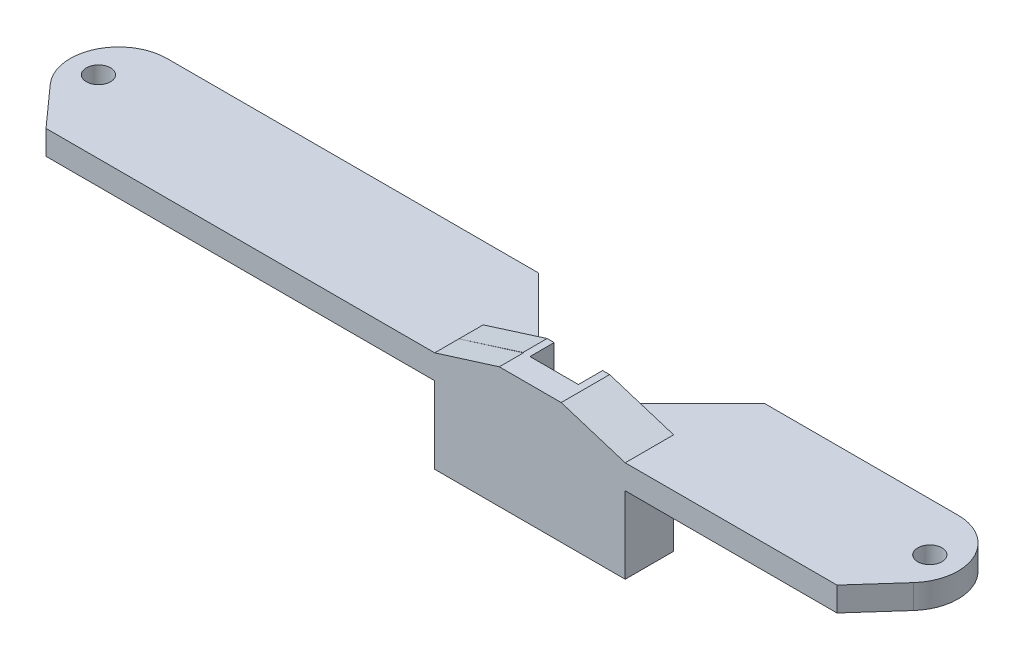
ISO-10303-21;
HEADER;
FILE_DESCRIPTION(('STEP AP214'),'2;1');
FILE_NAME('part.step','',(''),(''),'','','');
FILE_SCHEMA(('AUTOMOTIVE_DESIGN { 1 0 10303 214 1 1 1 1 }'));
ENDSEC;
DATA;
#1=APPLICATION_CONTEXT('core data for automotive mechanical design processes');
#2=APPLICATION_PROTOCOL_DEFINITION('international standard','automotive_design',2000,#1);
#3=PRODUCT_CONTEXT('',#1,'mechanical');
#4=PRODUCT('Part','Part','',(#3));
#5=PRODUCT_RELATED_PRODUCT_CATEGORY('part','',(#4));
#6=PRODUCT_DEFINITION_FORMATION('','',#4);
#7=PRODUCT_DEFINITION_CONTEXT('part definition',#1,'design');
#8=PRODUCT_DEFINITION('design','',#6,#7);
#9=PRODUCT_DEFINITION_SHAPE('','',#8);
#10=(LENGTH_UNIT() NAMED_UNIT(*) SI_UNIT(.MILLI.,.METRE.));
#11=(NAMED_UNIT(*) PLANE_ANGLE_UNIT() SI_UNIT($,.RADIAN.));
#12=(NAMED_UNIT(*) SI_UNIT($,.STERADIAN.) SOLID_ANGLE_UNIT());
#13=UNCERTAINTY_MEASURE_WITH_UNIT(LENGTH_MEASURE(1.E-05),#10,'distance_accuracy_value','');
#14=(GEOMETRIC_REPRESENTATION_CONTEXT(3) GLOBAL_UNCERTAINTY_ASSIGNED_CONTEXT((#13)) GLOBAL_UNIT_ASSIGNED_CONTEXT((#10,
#11,#12)) REPRESENTATION_CONTEXT('',''));
#15=CARTESIAN_POINT('',(0.,0.,0.));
#16=DIRECTION('',(0.,0.,1.));
#17=DIRECTION('',(1.,0.,0.));
#18=AXIS2_PLACEMENT_3D('',#15,#16,#17);
#19=CARTESIAN_POINT('',(-49.,3.,0.));
#20=DIRECTION('',(0.,-1.,0.));
#21=DIRECTION('',(0.,0.,-1.));
#22=AXIS2_PLACEMENT_3D('',#19,#20,#21);
#23=CYLINDRICAL_SURFACE('',#22,6.00000000000001);
#24=DIRECTION('',(0.,1.,0.));
#25=VECTOR('',#24,1.);
#26=CARTESIAN_POINT('',(-53.4721359549996,-6.70820393249936,4.00000000000002));
#27=LINE('',#26,#25);
#28=CARTESIAN_POINT('',(-53.4721359549996,0.,4.00000000000002));
#29=VERTEX_POINT('',#28);
#30=CARTESIAN_POINT('',(-53.4721359549996,3.,4.00000000000002));
#31=VERTEX_POINT('',#30);
#32=EDGE_CURVE('E238',#29,#31,#27,.T.);
#33=ORIENTED_EDGE('',*,*,#32,.T.);
#34=CARTESIAN_POINT('',(-49.,3.,0.));
#35=DIRECTION('',(0.,1.,0.));
#36=DIRECTION('',(0.,0.,1.));
#37=AXIS2_PLACEMENT_3D('',#34,#35,#36);
#38=CIRCLE('',#37,6.00000000000001);
#39=CARTESIAN_POINT('',(-49.,3.,-6.00000000000001));
#40=VERTEX_POINT('',#39);
#41=EDGE_CURVE('E250',#40,#31,#38,.T.);
#42=ORIENTED_EDGE('',*,*,#41,.F.);
#43=DIRECTION('',(0.,-1.,0.));
#44=VECTOR('',#43,1.);
#45=CARTESIAN_POINT('',(-49.,3.,-6.00000000000001));
#46=LINE('',#45,#44);
#47=CARTESIAN_POINT('',(-49.,0.,-6.00000000000001));
#48=VERTEX_POINT('',#47);
#49=EDGE_CURVE('E282',#40,#48,#46,.T.);
#50=ORIENTED_EDGE('',*,*,#49,.T.);
#51=CARTESIAN_POINT('',(-49.,0.,0.));
#52=DIRECTION('',(0.,1.,0.));
#53=DIRECTION('',(0.,0.,1.));
#54=AXIS2_PLACEMENT_3D('',#51,#52,#53);
#55=CIRCLE('',#54,6.00000000000001);
#56=EDGE_CURVE('E253',#48,#29,#55,.T.);
#57=ORIENTED_EDGE('',*,*,#56,.T.);
#58=EDGE_LOOP('',(#33,#42,#50,#57));
#59=FACE_BOUND('',#58,.T.);
#60=ADVANCED_FACE('F75',(#59),#23,.T.);
#61=CARTESIAN_POINT('',(-49.,3.,6.00000000000001));
#62=DIRECTION('',(0.,0.,-1.));
#63=DIRECTION('',(-1.,0.,0.));
#64=AXIS2_PLACEMENT_3D('',#61,#62,#63);
#65=PLANE('',#64);
#66=DIRECTION('',(-0.95447997803503,-0.298274993135947,0.));
#67=VECTOR('',#66,1.);
#68=CARTESIAN_POINT('',(-44.7152961585631,-10.7110522925982,6.00000000000001));
#69=LINE('',#68,#67);
#70=CARTESIAN_POINT('',(7.16007117775133,5.5,6.00000000000001));
#71=VERTEX_POINT('',#70);
#72=CARTESIAN_POINT('',(-0.839928822248676,3.,6.00000000000001));
#73=VERTEX_POINT('',#72);
#74=EDGE_CURVE('E442',#71,#73,#69,.T.);
#75=ORIENTED_EDGE('',*,*,#74,.F.);
#76=DIRECTION('',(1.,0.,0.));
#77=VECTOR('',#76,1.);
#78=CARTESIAN_POINT('',(0.,5.5,6.00000000000001));
#79=LINE('',#78,#77);
#80=CARTESIAN_POINT('',(7.08905818365937,5.5,6.00000000000001));
#81=VERTEX_POINT('',#80);
#82=EDGE_CURVE('E448',#81,#71,#79,.T.);
#83=ORIENTED_EDGE('',*,*,#82,.F.);
#84=DIRECTION('',(-0.953716950748227,-0.300705799504274,0.));
#85=VECTOR('',#84,1.);
#86=CARTESIAN_POINT('',(7.08905818365937,5.5,6.00000000000001));
#87=LINE('',#86,#85);
#88=EDGE_CURVE('E99',#81,#73,#87,.T.);
#89=ORIENTED_EDGE('',*,*,#88,.T.);
#90=EDGE_LOOP('',(#75,#83,#89));
#91=FACE_BOUND('',#90,.T.);
#92=ADVANCED_FACE('F321',(#91),#65,.F.);
#93=CARTESIAN_POINT('',(7.96007117775133,-7.,6.99999999999999));
#94=DIRECTION('',(1.,0.,0.));
#95=DIRECTION('',(0.,0.,-1.));
#96=AXIS2_PLACEMENT_3D('',#93,#94,#95);
#97=PLANE('',#96);
#98=DIRECTION('',(0.,-1.,0.));
#99=VECTOR('',#98,1.);
#100=CARTESIAN_POINT('',(7.96007117775133,3.,6.00000000000001));
#101=LINE('',#100,#99);
#102=CARTESIAN_POINT('',(7.96007117775133,5.5,6.00000000000001));
#103=VERTEX_POINT('',#102);
#104=CARTESIAN_POINT('',(7.96007117775133,-9.,6.00000000000001));
#105=VERTEX_POINT('',#104);
#106=EDGE_CURVE('E274',#103,#105,#101,.T.);
#107=ORIENTED_EDGE('',*,*,#106,.T.);
#108=DIRECTION('',(0.,0.,1.));
#109=VECTOR('',#108,1.);
#110=CARTESIAN_POINT('',(7.96007117775133,-9.,-3.02079728939615));
#111=LINE('',#110,#109);
#112=CARTESIAN_POINT('',(7.96007117775133,-9.,2.99999999999999));
#113=VERTEX_POINT('',#112);
#114=EDGE_CURVE('E405',#113,#105,#111,.T.);
#115=ORIENTED_EDGE('',*,*,#114,.F.);
#116=DIRECTION('',(0.,-1.,0.));
#117=VECTOR('',#116,1.);
#118=CARTESIAN_POINT('',(7.96007117775133,-7.,2.99999999999999));
#119=LINE('',#118,#117);
#120=CARTESIAN_POINT('',(7.96007117775133,5.5,2.99999999999999));
#121=VERTEX_POINT('',#120);
#122=EDGE_CURVE('E278',#121,#113,#119,.T.);
#123=ORIENTED_EDGE('',*,*,#122,.F.);
#124=DIRECTION('',(0.,0.,-1.));
#125=VECTOR('',#124,1.);
#126=CARTESIAN_POINT('',(7.96007117775133,5.5,6.00000000000001));
#127=LINE('',#126,#125);
#128=EDGE_CURVE('E303',#103,#121,#127,.T.);
#129=ORIENTED_EDGE('',*,*,#128,.F.);
#130=EDGE_LOOP('',(#107,#115,#123,#129));
#131=FACE_BOUND('',#130,.T.);
#132=ADVANCED_FACE('F328',(#131),#97,.T.);
#133=CARTESIAN_POINT('',(13.9600711777513,-9.5,6.00000000000001));
#134=DIRECTION('',(1.,0.,0.));
#135=DIRECTION('',(0.,0.,-1.));
#136=AXIS2_PLACEMENT_3D('',#133,#134,#135);
#137=PLANE('',#136);
#138=DIRECTION('',(0.,0.,1.));
#139=VECTOR('',#138,1.);
#140=CARTESIAN_POINT('',(13.9600711777513,-9.,-3.02079728939615));
#141=LINE('',#140,#139);
#142=CARTESIAN_POINT('',(13.9600711777513,-9.,2.99999999999999));
#143=VERTEX_POINT('',#142);
#144=CARTESIAN_POINT('',(13.9600711777513,-9.,6.00000000000001));
#145=VERTEX_POINT('',#144);
#146=EDGE_CURVE('E401',#143,#145,#141,.T.);
#147=ORIENTED_EDGE('',*,*,#146,.T.);
#148=DIRECTION('',(0.,1.,0.));
#149=VECTOR('',#148,1.);
#150=CARTESIAN_POINT('',(13.9600711777513,-9.5,6.00000000000001));
#151=LINE('',#150,#149);
#152=CARTESIAN_POINT('',(13.9600711777513,5.5,6.00000000000001));
#153=VERTEX_POINT('',#152);
#154=EDGE_CURVE('E266',#145,#153,#151,.T.);
#155=ORIENTED_EDGE('',*,*,#154,.T.);
#156=DIRECTION('',(0.,0.,-1.));
#157=VECTOR('',#156,1.);
#158=CARTESIAN_POINT('',(13.9600711777513,5.5,6.00000000000001));
#159=LINE('',#158,#157);
#160=CARTESIAN_POINT('',(13.9600711777513,5.5,2.99999999999999));
#161=VERTEX_POINT('',#160);
#162=EDGE_CURVE('E427',#153,#161,#159,.T.);
#163=ORIENTED_EDGE('',*,*,#162,.T.);
#164=DIRECTION('',(0.,1.,0.));
#165=VECTOR('',#164,1.);
#166=CARTESIAN_POINT('',(13.9600711777513,-9.5,2.99999999999999));
#167=LINE('',#166,#165);
#168=EDGE_CURVE('E261',#143,#161,#167,.T.);
#169=ORIENTED_EDGE('',*,*,#168,.F.);
#170=EDGE_LOOP('',(#147,#155,#163,#169));
#171=FACE_BOUND('',#170,.T.);
#172=ADVANCED_FACE('F333',(#171),#137,.F.);
#173=CARTESIAN_POINT('',(7.96007117775133,-9.5,6.00000000000001));
#174=DIRECTION('',(0.,0.,1.));
#175=DIRECTION('',(1.,0.,0.));
#176=AXIS2_PLACEMENT_3D('',#173,#174,#175);
#177=PLANE('',#176);
#178=DIRECTION('',(1.,0.,0.));
#179=VECTOR('',#178,1.);
#180=CARTESIAN_POINT('',(13.9600711777513,-9.,6.00000000000001));
#181=LINE('',#180,#179);
#182=EDGE_CURVE('E396',#105,#145,#181,.T.);
#183=ORIENTED_EDGE('',*,*,#182,.F.);
#184=ORIENTED_EDGE('',*,*,#106,.F.);
#185=DIRECTION('',(1.,0.,0.));
#186=VECTOR('',#185,1.);
#187=CARTESIAN_POINT('',(7.96007117775133,5.5,6.00000000000001));
#188=LINE('',#187,#186);
#189=EDGE_CURVE('E406',#103,#153,#188,.T.);
#190=ORIENTED_EDGE('',*,*,#189,.T.);
#191=ORIENTED_EDGE('',*,*,#154,.F.);
#192=EDGE_LOOP('',(#183,#184,#190,#191));
#193=FACE_BOUND('',#192,.T.);
#194=ADVANCED_FACE('F362',(#193),#177,.F.);
#195=CARTESIAN_POINT('',(-49.,0.,0.));
#196=DIRECTION('',(0.,1.,0.));
#197=DIRECTION('',(0.,0.,1.));
#198=AXIS2_PLACEMENT_3D('',#195,#196,#197);
#199=PLANE('',#198);
#200=CARTESIAN_POINT('',(49.,0.,0.));
#201=DIRECTION('',(0.,1.,0.));
#202=DIRECTION('',(0.,0.,1.));
#203=AXIS2_PLACEMENT_3D('',#200,#201,#202);
#204=CIRCLE('',#203,6.00000000000001);
#205=CARTESIAN_POINT('',(53.4721359549996,0.,4.00000000000002));
#206=VERTEX_POINT('',#205);
#207=CARTESIAN_POINT('',(49.,0.,-6.00000000000002));
#208=VERTEX_POINT('',#207);
#209=EDGE_CURVE('E494',#206,#208,#204,.T.);
#210=ORIENTED_EDGE('',*,*,#209,.F.);
#211=DIRECTION('',(-0.666666666666667,0.,0.74535599249993));
#212=VECTOR('',#211,1.);
#213=CARTESIAN_POINT('',(49.,0.,9.00000000000001));
#214=LINE('',#213,#212);
#215=CARTESIAN_POINT('',(49.,0.,9.00000000000001));
#216=VERTEX_POINT('',#215);
#217=EDGE_CURVE('E553',#206,#216,#214,.T.);
#218=ORIENTED_EDGE('',*,*,#217,.T.);
#219=DIRECTION('',(1.,0.,0.));
#220=VECTOR('',#219,1.);
#221=CARTESIAN_POINT('',(-49.,0.,9.00000000000001));
#222=LINE('',#221,#220);
#223=CARTESIAN_POINT('',(22.7600711777513,0.,9.00000000000001));
#224=VERTEX_POINT('',#223);
#225=EDGE_CURVE('E528',#224,#216,#222,.T.);
#226=ORIENTED_EDGE('',*,*,#225,.F.);
#227=DIRECTION('',(0.,0.,1.));
#228=VECTOR('',#227,1.);
#229=CARTESIAN_POINT('',(22.7600711777513,0.,0.));
#230=LINE('',#229,#228);
#231=CARTESIAN_POINT('',(22.7600711777513,0.,2.99999999999999));
#232=VERTEX_POINT('',#231);
#233=EDGE_CURVE('E469',#232,#224,#230,.T.);
#234=ORIENTED_EDGE('',*,*,#233,.F.);
#235=DIRECTION('',(1.,0.,0.));
#236=VECTOR('',#235,1.);
#237=CARTESIAN_POINT('',(-49.,0.,2.99999999999999));
#238=LINE('',#237,#236);
#239=CARTESIAN_POINT('',(16.,0.,2.99999999999999));
#240=VERTEX_POINT('',#239);
#241=EDGE_CURVE('E466',#240,#232,#238,.T.);
#242=ORIENTED_EDGE('',*,*,#241,.F.);
#243=DIRECTION('',(0.707106781186549,0.,-0.707106781186546));
#244=VECTOR('',#243,1.);
#245=CARTESIAN_POINT('',(9.49999999999997,0.,9.5));
#246=LINE('',#245,#244);
#247=CARTESIAN_POINT('',(25.,0.,-6.00000000000001));
#248=VERTEX_POINT('',#247);
#249=EDGE_CURVE('E478',#240,#248,#246,.T.);
#250=ORIENTED_EDGE('',*,*,#249,.T.);
#251=DIRECTION('',(1.,0.,0.));
#252=VECTOR('',#251,1.);
#253=CARTESIAN_POINT('',(-49.,0.,-6.00000000000001));
#254=LINE('',#253,#252);
#255=EDGE_CURVE('E500',#248,#208,#254,.T.);
#256=ORIENTED_EDGE('',*,*,#255,.T.);
#257=EDGE_LOOP('',(#210,#218,#226,#234,#242,#250,#256));
#258=FACE_BOUND('',#257,.T.);
#259=CARTESIAN_POINT('',(51.5,0.,0.));
#260=DIRECTION('',(0.,1.,0.));
#261=DIRECTION('',(0.,0.,1.));
#262=AXIS2_PLACEMENT_3D('',#259,#260,#261);
#263=CIRCLE('',#262,1.5);
#264=CARTESIAN_POINT('',(51.5,0.,1.5));
#265=VERTEX_POINT('',#264);
#266=EDGE_CURVE('E490',#265,#265,#263,.T.);
#267=ORIENTED_EDGE('',*,*,#266,.T.);
#268=EDGE_LOOP('',(#267));
#269=FACE_BOUND('',#268,.T.);
#270=ADVANCED_FACE('F357',(#258,#269),#199,.F.);
#271=CARTESIAN_POINT('',(-49.,3.,0.));
#272=DIRECTION('',(0.,1.,0.));
#273=DIRECTION('',(0.,0.,1.));
#274=AXIS2_PLACEMENT_3D('',#271,#272,#273);
#275=PLANE('',#274);
#276=DIRECTION('',(0.666666666666667,0.,-0.74535599249993));
#277=VECTOR('',#276,1.);
#278=CARTESIAN_POINT('',(49.,3.,9.00000000000001));
#279=LINE('',#278,#277);
#280=CARTESIAN_POINT('',(49.,3.,9.00000000000001));
#281=VERTEX_POINT('',#280);
#282=CARTESIAN_POINT('',(53.4721359549996,3.,4.00000000000002));
#283=VERTEX_POINT('',#282);
#284=EDGE_CURVE('E246',#281,#283,#279,.T.);
#285=ORIENTED_EDGE('',*,*,#284,.T.);
#286=CARTESIAN_POINT('',(49.,3.,0.));
#287=DIRECTION('',(0.,1.,0.));
#288=DIRECTION('',(0.,0.,1.));
#289=AXIS2_PLACEMENT_3D('',#286,#287,#288);
#290=CIRCLE('',#289,6.00000000000001);
#291=CARTESIAN_POINT('',(49.,3.,-6.00000000000002));
#292=VERTEX_POINT('',#291);
#293=EDGE_CURVE('E497',#283,#292,#290,.T.);
#294=ORIENTED_EDGE('',*,*,#293,.T.);
#295=DIRECTION('',(1.,0.,0.));
#296=VECTOR('',#295,1.);
#297=CARTESIAN_POINT('',(-49.,3.,-6.00000000000001));
#298=LINE('',#297,#296);
#299=CARTESIAN_POINT('',(25.,3.,-6.00000000000001));
#300=VERTEX_POINT('',#299);
#301=EDGE_CURVE('E499',#300,#292,#298,.T.);
#302=ORIENTED_EDGE('',*,*,#301,.F.);
#303=DIRECTION('',(0.707106781186549,0.,-0.707106781186546));
#304=VECTOR('',#303,1.);
#305=CARTESIAN_POINT('',(9.49999999999997,3.,9.5));
#306=LINE('',#305,#304);
#307=CARTESIAN_POINT('',(16.,3.,2.99999999999999));
#308=VERTEX_POINT('',#307);
#309=EDGE_CURVE('E481',#308,#300,#306,.T.);
#310=ORIENTED_EDGE('',*,*,#309,.F.);
#311=DIRECTION('',(1.,0.,0.));
#312=VECTOR('',#311,1.);
#313=CARTESIAN_POINT('',(-49.,3.,2.99999999999999));
#314=LINE('',#313,#312);
#315=CARTESIAN_POINT('',(22.7600711777513,3.,2.99999999999999));
#316=VERTEX_POINT('',#315);
#317=EDGE_CURVE('E461',#308,#316,#314,.T.);
#318=ORIENTED_EDGE('',*,*,#317,.T.);
#319=DIRECTION('',(0.,0.,1.));
#320=VECTOR('',#319,1.);
#321=CARTESIAN_POINT('',(22.7600711777513,3.,0.));
#322=LINE('',#321,#320);
#323=CARTESIAN_POINT('',(22.7600711777513,3.,9.00000000000001));
#324=VERTEX_POINT('',#323);
#325=EDGE_CURVE('E277',#316,#324,#322,.T.);
#326=ORIENTED_EDGE('',*,*,#325,.T.);
#327=DIRECTION('',(-1.,0.,0.));
#328=VECTOR('',#327,1.);
#329=CARTESIAN_POINT('',(-49.,3.,9.00000000000001));
#330=LINE('',#329,#328);
#331=EDGE_CURVE('E534',#281,#324,#330,.T.);
#332=ORIENTED_EDGE('',*,*,#331,.F.);
#333=EDGE_LOOP('',(#285,#294,#302,#310,#318,#326,#332));
#334=FACE_BOUND('',#333,.T.);
#335=CARTESIAN_POINT('',(51.5,3.,0.));
#336=DIRECTION('',(0.,1.,0.));
#337=DIRECTION('',(0.,0.,1.));
#338=AXIS2_PLACEMENT_3D('',#335,#336,#337);
#339=CIRCLE('',#338,1.5);
#340=CARTESIAN_POINT('',(51.5,3.,1.5));
#341=VERTEX_POINT('',#340);
#342=EDGE_CURVE('E491',#341,#341,#339,.T.);
#343=ORIENTED_EDGE('',*,*,#342,.F.);
#344=EDGE_LOOP('',(#343));
#345=FACE_BOUND('',#344,.T.);
#346=ADVANCED_FACE('F353',(#334,#345),#275,.T.);
#347=CARTESIAN_POINT('',(-49.,3.,0.));
#348=DIRECTION('',(0.,1.,0.));
#349=DIRECTION('',(0.,0.,1.));
#350=AXIS2_PLACEMENT_3D('',#347,#348,#349);
#351=PLANE('',#350);
#352=ORIENTED_EDGE('',*,*,#41,.T.);
#353=DIRECTION('',(0.666666666666667,0.,0.74535599249993));
#354=VECTOR('',#353,1.);
#355=CARTESIAN_POINT('',(-49.,3.,9.00000000000001));
#356=LINE('',#355,#354);
#357=CARTESIAN_POINT('',(-49.,3.,9.00000000000001));
#358=VERTEX_POINT('',#357);
#359=EDGE_CURVE('E235',#31,#358,#356,.T.);
#360=ORIENTED_EDGE('',*,*,#359,.T.);
#361=DIRECTION('',(-1.,0.,0.));
#362=VECTOR('',#361,1.);
#363=CARTESIAN_POINT('',(-49.,3.,9.00000000000001));
#364=LINE('',#363,#362);
#365=CARTESIAN_POINT('',(-0.839928822248662,3.,9.00000000000001));
#366=VERTEX_POINT('',#365);
#367=EDGE_CURVE('E563',#366,#358,#364,.T.);
#368=ORIENTED_EDGE('',*,*,#367,.F.);
#369=DIRECTION('',(0.,0.,-1.));
#370=VECTOR('',#369,1.);
#371=CARTESIAN_POINT('',(-0.839928822248662,3.,9.00000000000001));
#372=LINE('',#371,#370);
#373=EDGE_CURVE('E402',#366,#73,#372,.T.);
#374=ORIENTED_EDGE('',*,*,#373,.T.);
#375=DIRECTION('',(0.,0.,1.));
#376=VECTOR('',#375,1.);
#377=CARTESIAN_POINT('',(-0.839928822248676,3.,0.));
#378=LINE('',#377,#376);
#379=CARTESIAN_POINT('',(-0.839928822248669,3.,2.99999999999999));
#380=VERTEX_POINT('',#379);
#381=EDGE_CURVE('E476',#380,#73,#378,.T.);
#382=ORIENTED_EDGE('',*,*,#381,.F.);
#383=DIRECTION('',(-1.,0.,0.));
#384=VECTOR('',#383,1.);
#385=CARTESIAN_POINT('',(-49.,3.,3.));
#386=LINE('',#385,#384);
#387=CARTESIAN_POINT('',(6.00000000000004,3.,2.99999999999999));
#388=VERTEX_POINT('',#387);
#389=EDGE_CURVE('E296',#388,#380,#386,.T.);
#390=ORIENTED_EDGE('',*,*,#389,.F.);
#391=DIRECTION('',(0.707106781186547,0.,0.707106781186548));
#392=VECTOR('',#391,1.);
#393=CARTESIAN_POINT('',(-2.99999999999996,3.,-6.00000000000001));
#394=LINE('',#393,#392);
#395=CARTESIAN_POINT('',(-2.99999999999996,3.,-6.00000000000001));
#396=VERTEX_POINT('',#395);
#397=EDGE_CURVE('E423',#396,#388,#394,.T.);
#398=ORIENTED_EDGE('',*,*,#397,.F.);
#399=DIRECTION('',(1.,0.,0.));
#400=VECTOR('',#399,1.);
#401=CARTESIAN_POINT('',(-49.,3.,-6.00000000000001));
#402=LINE('',#401,#400);
#403=EDGE_CURVE('E259',#40,#396,#402,.T.);
#404=ORIENTED_EDGE('',*,*,#403,.F.);
#405=EDGE_LOOP('',(#352,#360,#368,#374,#382,#390,#398,#404));
#406=FACE_BOUND('',#405,.T.);
#407=CARTESIAN_POINT('',(-51.5,3.,0.));
#408=DIRECTION('',(0.,1.,0.));
#409=DIRECTION('',(0.,0.,1.));
#410=AXIS2_PLACEMENT_3D('',#407,#408,#409);
#411=CIRCLE('',#410,1.5);
#412=CARTESIAN_POINT('',(-51.5,3.,1.5));
#413=VERTEX_POINT('',#412);
#414=EDGE_CURVE('E271',#413,#413,#411,.T.);
#415=ORIENTED_EDGE('',*,*,#414,.F.);
#416=EDGE_LOOP('',(#415));
#417=FACE_BOUND('',#416,.T.);
#418=ADVANCED_FACE('F256',(#406,#417),#351,.T.);
#419=CARTESIAN_POINT('',(-49.,0.,0.));
#420=DIRECTION('',(0.,1.,0.));
#421=DIRECTION('',(0.,0.,1.));
#422=AXIS2_PLACEMENT_3D('',#419,#420,#421);
#423=PLANE('',#422);
#424=DIRECTION('',(-1.,0.,0.));
#425=VECTOR('',#424,1.);
#426=CARTESIAN_POINT('',(-49.,0.,3.));
#427=LINE('',#426,#425);
#428=CARTESIAN_POINT('',(6.00000000000004,0.,2.99999999999999));
#429=VERTEX_POINT('',#428);
#430=CARTESIAN_POINT('',(-0.83992882224867,0.,2.99999999999999));
#431=VERTEX_POINT('',#430);
#432=EDGE_CURVE('E471',#429,#431,#427,.T.);
#433=ORIENTED_EDGE('',*,*,#432,.T.);
#434=DIRECTION('',(0.,0.,1.));
#435=VECTOR('',#434,1.);
#436=CARTESIAN_POINT('',(-0.839928822248676,0.,0.));
#437=LINE('',#436,#435);
#438=CARTESIAN_POINT('',(-0.839928822248669,0.,9.00000000000001));
#439=VERTEX_POINT('',#438);
#440=EDGE_CURVE('E474',#431,#439,#437,.T.);
#441=ORIENTED_EDGE('',*,*,#440,.T.);
#442=DIRECTION('',(1.,0.,0.));
#443=VECTOR('',#442,1.);
#444=CARTESIAN_POINT('',(-49.,0.,9.00000000000001));
#445=LINE('',#444,#443);
#446=CARTESIAN_POINT('',(-49.,0.,9.00000000000001));
#447=VERTEX_POINT('',#446);
#448=EDGE_CURVE('E510',#447,#439,#445,.T.);
#449=ORIENTED_EDGE('',*,*,#448,.F.);
#450=DIRECTION('',(-0.666666666666667,0.,-0.74535599249993));
#451=VECTOR('',#450,1.);
#452=CARTESIAN_POINT('',(-49.,0.,9.00000000000001));
#453=LINE('',#452,#451);
#454=EDGE_CURVE('E254',#447,#29,#453,.T.);
#455=ORIENTED_EDGE('',*,*,#454,.T.);
#456=ORIENTED_EDGE('',*,*,#56,.F.);
#457=DIRECTION('',(1.,0.,0.));
#458=VECTOR('',#457,1.);
#459=CARTESIAN_POINT('',(-49.,0.,-6.00000000000001));
#460=LINE('',#459,#458);
#461=CARTESIAN_POINT('',(-2.99999999999996,0.,-6.00000000000001));
#462=VERTEX_POINT('',#461);
#463=EDGE_CURVE('E264',#48,#462,#460,.T.);
#464=ORIENTED_EDGE('',*,*,#463,.T.);
#465=DIRECTION('',(0.707106781186547,0.,0.707106781186548));
#466=VECTOR('',#465,1.);
#467=CARTESIAN_POINT('',(-2.99999999999996,0.,-6.00000000000001));
#468=LINE('',#467,#466);
#469=EDGE_CURVE('E422',#462,#429,#468,.T.);
#470=ORIENTED_EDGE('',*,*,#469,.T.);
#471=EDGE_LOOP('',(#433,#441,#449,#455,#456,#464,#470));
#472=FACE_BOUND('',#471,.T.);
#473=CARTESIAN_POINT('',(-51.5,0.,0.));
#474=DIRECTION('',(0.,1.,0.));
#475=DIRECTION('',(0.,0.,1.));
#476=AXIS2_PLACEMENT_3D('',#473,#474,#475);
#477=CIRCLE('',#476,1.5);
#478=CARTESIAN_POINT('',(-51.5,0.,1.5));
#479=VERTEX_POINT('',#478);
#480=EDGE_CURVE('E260',#479,#479,#477,.T.);
#481=ORIENTED_EDGE('',*,*,#480,.T.);
#482=EDGE_LOOP('',(#481));
#483=FACE_BOUND('',#482,.T.);
#484=ADVANCED_FACE('F348',(#472,#483),#423,.F.);
#485=CARTESIAN_POINT('',(0.,-7.,2.99999999999999));
#486=DIRECTION('',(0.,0.,1.));
#487=DIRECTION('',(1.,0.,0.));
#488=AXIS2_PLACEMENT_3D('',#485,#486,#487);
#489=PLANE('',#488);
#490=ORIENTED_EDGE('',*,*,#389,.T.);
#491=DIRECTION('',(0.953716950748227,0.300705799504274,0.));
#492=VECTOR('',#491,1.);
#493=CARTESIAN_POINT('',(7.08905818365937,5.5,2.99999999999999));
#494=LINE('',#493,#492);
#495=CARTESIAN_POINT('',(7.08905818365937,5.5,2.99999999999999));
#496=VERTEX_POINT('',#495);
#497=EDGE_CURVE('E84',#380,#496,#494,.T.);
#498=ORIENTED_EDGE('',*,*,#497,.T.);
#499=DIRECTION('',(1.,0.,0.));
#500=VECTOR('',#499,1.);
#501=CARTESIAN_POINT('',(7.16007117775133,5.5,2.99999999999999));
#502=LINE('',#501,#500);
#503=EDGE_CURVE('E293',#496,#121,#502,.T.);
#504=ORIENTED_EDGE('',*,*,#503,.T.);
#505=ORIENTED_EDGE('',*,*,#122,.T.);
#506=DIRECTION('',(-1.,0.,0.));
#507=VECTOR('',#506,1.);
#508=CARTESIAN_POINT('',(13.9600711777513,-9.,2.99999999999999));
#509=LINE('',#508,#507);
#510=EDGE_CURVE('E462',#143,#113,#509,.T.);
#511=ORIENTED_EDGE('',*,*,#510,.F.);
#512=ORIENTED_EDGE('',*,*,#168,.T.);
#513=DIRECTION('',(1.,0.,0.));
#514=VECTOR('',#513,1.);
#515=CARTESIAN_POINT('',(13.9600711777513,5.5,2.99999999999999));
#516=LINE('',#515,#514);
#517=CARTESIAN_POINT('',(14.8310841718433,5.5,2.99999999999999));
#518=VERTEX_POINT('',#517);
#519=EDGE_CURVE('E430',#161,#518,#516,.T.);
#520=ORIENTED_EDGE('',*,*,#519,.T.);
#521=DIRECTION('',(-0.953716950748227,0.300705799504274,0.));
#522=VECTOR('',#521,1.);
#523=CARTESIAN_POINT('',(22.7600711777513,3.,2.99999999999999));
#524=LINE('',#523,#522);
#525=EDGE_CURVE('E12',#518,#316,#524,.F.);
#526=ORIENTED_EDGE('',*,*,#525,.T.);
#527=ORIENTED_EDGE('',*,*,#317,.F.);
#528=DIRECTION('',(0.,-1.,0.));
#529=VECTOR('',#528,1.);
#530=CARTESIAN_POINT('',(16.,20.4928556845359,2.99999999999999));
#531=LINE('',#530,#529);
#532=EDGE_CURVE('E487',#308,#240,#531,.T.);
#533=ORIENTED_EDGE('',*,*,#532,.T.);
#534=ORIENTED_EDGE('',*,*,#241,.T.);
#535=DIRECTION('',(0.,1.,0.));
#536=VECTOR('',#535,1.);
#537=CARTESIAN_POINT('',(22.7600711777513,-9.5,2.99999999999999));
#538=LINE('',#537,#536);
#539=CARTESIAN_POINT('',(22.7600711777513,-9.5,2.99999999999999));
#540=VERTEX_POINT('',#539);
#541=EDGE_CURVE('E450',#540,#232,#538,.T.);
#542=ORIENTED_EDGE('',*,*,#541,.F.);
#543=DIRECTION('',(1.,0.,0.));
#544=VECTOR('',#543,1.);
#545=CARTESIAN_POINT('',(13.9600711777513,-9.5,2.99999999999999));
#546=LINE('',#545,#544);
#547=CARTESIAN_POINT('',(-0.83992882224867,-9.5,2.99999999999999));
#548=VERTEX_POINT('',#547);
#549=EDGE_CURVE('E408',#548,#540,#546,.T.);
#550=ORIENTED_EDGE('',*,*,#549,.F.);
#551=DIRECTION('',(0.,1.,0.));
#552=VECTOR('',#551,1.);
#553=CARTESIAN_POINT('',(-0.83992882224867,-9.5,2.99999999999999));
#554=LINE('',#553,#552);
#555=EDGE_CURVE('E452',#548,#431,#554,.T.);
#556=ORIENTED_EDGE('',*,*,#555,.T.);
#557=ORIENTED_EDGE('',*,*,#432,.F.);
#558=DIRECTION('',(0.,-1.,0.));
#559=VECTOR('',#558,1.);
#560=CARTESIAN_POINT('',(6.00000000000004,20.4928556845359,2.99999999999999));
#561=LINE('',#560,#559);
#562=EDGE_CURVE('E426',#388,#429,#561,.T.);
#563=ORIENTED_EDGE('',*,*,#562,.F.);
#564=EDGE_LOOP('',(#490,#498,#504,#505,#511,#512,#520,#526,#527,#533,#534,#542,#550,#556,#557,#563));
#565=FACE_BOUND('',#564,.T.);
#566=ADVANCED_FACE('F292',(#565),#489,.F.);
#567=CARTESIAN_POINT('',(-49.,3.,-6.00000000000001));
#568=DIRECTION('',(0.,0.,-1.));
#569=DIRECTION('',(-1.,0.,0.));
#570=AXIS2_PLACEMENT_3D('',#567,#568,#569);
#571=PLANE('',#570);
#572=ORIENTED_EDGE('',*,*,#403,.T.);
#573=DIRECTION('',(0.,-1.,0.));
#574=VECTOR('',#573,1.);
#575=CARTESIAN_POINT('',(-2.99999999999996,20.4928556845359,-6.00000000000001));
#576=LINE('',#575,#574);
#577=EDGE_CURVE('E419',#396,#462,#576,.T.);
#578=ORIENTED_EDGE('',*,*,#577,.T.);
#579=ORIENTED_EDGE('',*,*,#463,.F.);
#580=ORIENTED_EDGE('',*,*,#49,.F.);
#581=EDGE_LOOP('',(#572,#578,#579,#580));
#582=FACE_BOUND('',#581,.T.);
#583=ADVANCED_FACE('F339',(#582),#571,.T.);
#584=CARTESIAN_POINT('',(-51.5,3.,0.));
#585=DIRECTION('',(0.,-1.,0.));
#586=DIRECTION('',(0.,0.,-1.));
#587=AXIS2_PLACEMENT_3D('',#584,#585,#586);
#588=CYLINDRICAL_SURFACE('',#587,1.5);
#589=ORIENTED_EDGE('',*,*,#414,.T.);
#590=EDGE_LOOP('',(#589));
#591=FACE_BOUND('',#590,.T.);
#592=ORIENTED_EDGE('',*,*,#480,.F.);
#593=EDGE_LOOP('',(#592));
#594=FACE_BOUND('',#593,.T.);
#595=ADVANCED_FACE('F335',(#591,#594),#588,.F.);
#596=CARTESIAN_POINT('',(0.,-9.5,0.));
#597=DIRECTION('',(0.,-1.,0.));
#598=DIRECTION('',(0.,0.,-1.));
#599=AXIS2_PLACEMENT_3D('',#596,#597,#598);
#600=PLANE('',#599);
#601=DIRECTION('',(0.,0.,1.));
#602=VECTOR('',#601,1.);
#603=CARTESIAN_POINT('',(22.7600711777513,-9.5,0.));
#604=LINE('',#603,#602);
#605=CARTESIAN_POINT('',(22.7600711777513,-9.50000000000001,9.00000000000001));
#606=VERTEX_POINT('',#605);
#607=EDGE_CURVE('E455',#540,#606,#604,.T.);
#608=ORIENTED_EDGE('',*,*,#607,.T.);
#609=DIRECTION('',(1.,0.,0.));
#610=VECTOR('',#609,1.);
#611=CARTESIAN_POINT('',(-49.,-9.50000000000003,9.00000000000001));
#612=LINE('',#611,#610);
#613=CARTESIAN_POINT('',(-0.839928822248669,-9.50000000000001,9.00000000000001));
#614=VERTEX_POINT('',#613);
#615=EDGE_CURVE('E520',#614,#606,#612,.T.);
#616=ORIENTED_EDGE('',*,*,#615,.F.);
#617=DIRECTION('',(0.,0.,1.));
#618=VECTOR('',#617,1.);
#619=CARTESIAN_POINT('',(-0.839928822248672,-9.5,0.));
#620=LINE('',#619,#618);
#621=EDGE_CURVE('E449',#548,#614,#620,.T.);
#622=ORIENTED_EDGE('',*,*,#621,.F.);
#623=ORIENTED_EDGE('',*,*,#549,.T.);
#624=EDGE_LOOP('',(#608,#616,#622,#623));
#625=FACE_BOUND('',#624,.T.);
#626=ADVANCED_FACE('F338',(#625),#600,.T.);
#627=CARTESIAN_POINT('',(0.,5.5,0.));
#628=DIRECTION('',(0.,-1.,0.));
#629=DIRECTION('',(0.,0.,-1.));
#630=AXIS2_PLACEMENT_3D('',#627,#628,#629);
#631=PLANE('',#630);
#632=DIRECTION('',(0.,0.,-1.));
#633=VECTOR('',#632,1.);
#634=CARTESIAN_POINT('',(7.16007117775133,5.5,6.80000000000001));
#635=LINE('',#634,#633);
#636=CARTESIAN_POINT('',(7.16007117775136,5.50000000000001,9.00000000000001));
#637=VERTEX_POINT('',#636);
#638=EDGE_CURVE('E304',#637,#71,#635,.T.);
#639=ORIENTED_EDGE('',*,*,#638,.F.);
#640=DIRECTION('',(-1.,0.,0.));
#641=VECTOR('',#640,1.);
#642=CARTESIAN_POINT('',(-49.,5.5,9.00000000000001));
#643=LINE('',#642,#641);
#644=CARTESIAN_POINT('',(14.8310841718433,5.5,9.00000000000001));
#645=VERTEX_POINT('',#644);
#646=EDGE_CURVE('E446',#645,#637,#643,.T.);
#647=ORIENTED_EDGE('',*,*,#646,.F.);
#648=DIRECTION('',(0.,0.,-1.));
#649=VECTOR('',#648,1.);
#650=CARTESIAN_POINT('',(14.8310841718433,5.5,0.));
#651=LINE('',#650,#649);
#652=EDGE_CURVE('E91',#645,#518,#651,.T.);
#653=ORIENTED_EDGE('',*,*,#652,.T.);
#654=ORIENTED_EDGE('',*,*,#519,.F.);
#655=ORIENTED_EDGE('',*,*,#162,.F.);
#656=ORIENTED_EDGE('',*,*,#189,.F.);
#657=ORIENTED_EDGE('',*,*,#128,.T.);
#658=ORIENTED_EDGE('',*,*,#503,.F.);
#659=DIRECTION('',(0.,0.,1.));
#660=VECTOR('',#659,1.);
#661=CARTESIAN_POINT('',(7.08905818365937,5.5,6.));
#662=LINE('',#661,#660);
#663=EDGE_CURVE('E286',#496,#81,#662,.T.);
#664=ORIENTED_EDGE('',*,*,#663,.T.);
#665=ORIENTED_EDGE('',*,*,#82,.T.);
#666=EDGE_LOOP('',(#639,#647,#653,#654,#655,#656,#657,#658,#664,#665));
#667=FACE_BOUND('',#666,.T.);
#668=ADVANCED_FACE('F298',(#667),#631,.F.);
#669=CARTESIAN_POINT('',(-2.99999999999996,20.4928556845359,-6.00000000000001));
#670=DIRECTION('',(0.707106781186548,0.,-0.707106781186547));
#671=DIRECTION('',(-0.707106781186547,0.,-0.707106781186548));
#672=AXIS2_PLACEMENT_3D('',#669,#670,#671);
#673=PLANE('',#672);
#674=ORIENTED_EDGE('',*,*,#577,.F.);
#675=ORIENTED_EDGE('',*,*,#397,.T.);
#676=ORIENTED_EDGE('',*,*,#562,.T.);
#677=ORIENTED_EDGE('',*,*,#469,.F.);
#678=EDGE_LOOP('',(#674,#675,#676,#677));
#679=FACE_BOUND('',#678,.T.);
#680=ADVANCED_FACE('F380',(#679),#673,.T.);
#681=CARTESIAN_POINT('',(51.5,3.,0.));
#682=DIRECTION('',(0.,-1.,0.));
#683=DIRECTION('',(0.,0.,-1.));
#684=AXIS2_PLACEMENT_3D('',#681,#682,#683);
#685=CYLINDRICAL_SURFACE('',#684,1.5);
#686=ORIENTED_EDGE('',*,*,#342,.T.);
#687=EDGE_LOOP('',(#686));
#688=FACE_BOUND('',#687,.T.);
#689=ORIENTED_EDGE('',*,*,#266,.F.);
#690=EDGE_LOOP('',(#689));
#691=FACE_BOUND('',#690,.T.);
#692=ADVANCED_FACE('F368',(#688,#691),#685,.F.);
#693=CARTESIAN_POINT('',(-49.,3.,-6.00000000000001));
#694=DIRECTION('',(0.,0.,-1.));
#695=DIRECTION('',(-1.,0.,0.));
#696=AXIS2_PLACEMENT_3D('',#693,#694,#695);
#697=PLANE('',#696);
#698=ORIENTED_EDGE('',*,*,#255,.F.);
#699=DIRECTION('',(0.,-1.,0.));
#700=VECTOR('',#699,1.);
#701=CARTESIAN_POINT('',(25.,20.4928556845359,-6.00000000000001));
#702=LINE('',#701,#700);
#703=EDGE_CURVE('E484',#300,#248,#702,.T.);
#704=ORIENTED_EDGE('',*,*,#703,.F.);
#705=ORIENTED_EDGE('',*,*,#301,.T.);
#706=DIRECTION('',(0.,-1.,0.));
#707=VECTOR('',#706,1.);
#708=CARTESIAN_POINT('',(49.,3.,-6.00000000000002));
#709=LINE('',#708,#707);
#710=EDGE_CURVE('E503',#292,#208,#709,.T.);
#711=ORIENTED_EDGE('',*,*,#710,.T.);
#712=EDGE_LOOP('',(#698,#704,#705,#711));
#713=FACE_BOUND('',#712,.T.);
#714=ADVANCED_FACE('F371',(#713),#697,.T.);
#715=CARTESIAN_POINT('',(49.,3.,0.));
#716=DIRECTION('',(0.,-1.,0.));
#717=DIRECTION('',(0.,0.,-1.));
#718=AXIS2_PLACEMENT_3D('',#715,#716,#717);
#719=CYLINDRICAL_SURFACE('',#718,6.00000000000001);
#720=ORIENTED_EDGE('',*,*,#293,.F.);
#721=DIRECTION('',(0.,1.,0.));
#722=VECTOR('',#721,1.);
#723=CARTESIAN_POINT('',(53.4721359549996,-6.70820393249936,4.00000000000002));
#724=LINE('',#723,#722);
#725=EDGE_CURVE('E555',#206,#283,#724,.T.);
#726=ORIENTED_EDGE('',*,*,#725,.F.);
#727=ORIENTED_EDGE('',*,*,#209,.T.);
#728=ORIENTED_EDGE('',*,*,#710,.F.);
#729=EDGE_LOOP('',(#720,#726,#727,#728));
#730=FACE_BOUND('',#729,.T.);
#731=ADVANCED_FACE('F374',(#730),#719,.T.);
#732=CARTESIAN_POINT('',(9.49999999999997,20.4928556845359,9.5));
#733=DIRECTION('',(-0.707106781186546,0.,-0.707106781186549));
#734=DIRECTION('',(-0.707106781186549,0.,0.707106781186546));
#735=AXIS2_PLACEMENT_3D('',#732,#733,#734);
#736=PLANE('',#735);
#737=ORIENTED_EDGE('',*,*,#532,.F.);
#738=ORIENTED_EDGE('',*,*,#309,.T.);
#739=ORIENTED_EDGE('',*,*,#703,.T.);
#740=ORIENTED_EDGE('',*,*,#249,.F.);
#741=EDGE_LOOP('',(#737,#738,#739,#740));
#742=FACE_BOUND('',#741,.T.);
#743=ADVANCED_FACE('F378',(#742),#736,.T.);
#744=CARTESIAN_POINT('',(22.7600711777513,-9.5,0.));
#745=DIRECTION('',(-1.,0.,0.));
#746=DIRECTION('',(0.,0.,1.));
#747=AXIS2_PLACEMENT_3D('',#744,#745,#746);
#748=PLANE('',#747);
#749=ORIENTED_EDGE('',*,*,#541,.T.);
#750=ORIENTED_EDGE('',*,*,#233,.T.);
#751=DIRECTION('',(0.,1.,0.));
#752=VECTOR('',#751,1.);
#753=CARTESIAN_POINT('',(22.7600711777513,3.,9.00000000000001));
#754=LINE('',#753,#752);
#755=EDGE_CURVE('E522',#606,#224,#754,.T.);
#756=ORIENTED_EDGE('',*,*,#755,.F.);
#757=ORIENTED_EDGE('',*,*,#607,.F.);
#758=EDGE_LOOP('',(#749,#750,#756,#757));
#759=FACE_BOUND('',#758,.T.);
#760=ADVANCED_FACE('F315',(#759),#748,.F.);
#761=CARTESIAN_POINT('',(-0.839928822248672,-9.5,0.));
#762=DIRECTION('',(-1.,0.,0.));
#763=DIRECTION('',(0.,0.,1.));
#764=AXIS2_PLACEMENT_3D('',#761,#762,#763);
#765=PLANE('',#764);
#766=ORIENTED_EDGE('',*,*,#440,.F.);
#767=ORIENTED_EDGE('',*,*,#555,.F.);
#768=ORIENTED_EDGE('',*,*,#621,.T.);
#769=DIRECTION('',(0.,-1.,0.));
#770=VECTOR('',#769,1.);
#771=CARTESIAN_POINT('',(-0.839928822248669,3.,9.00000000000001));
#772=LINE('',#771,#770);
#773=EDGE_CURVE('E516',#439,#614,#772,.T.);
#774=ORIENTED_EDGE('',*,*,#773,.F.);
#775=EDGE_LOOP('',(#766,#767,#768,#774));
#776=FACE_BOUND('',#775,.T.);
#777=ADVANCED_FACE('F308',(#776),#765,.T.);
#778=CARTESIAN_POINT('',(7.08905818365937,5.5,0.));
#779=DIRECTION('',(-0.300705799504274,0.953716950748227,0.));
#780=DIRECTION('',(0.,0.,-1.));
#781=AXIS2_PLACEMENT_3D('',#778,#779,#780);
#782=PLANE('',#781);
#783=ORIENTED_EDGE('',*,*,#497,.F.);
#784=ORIENTED_EDGE('',*,*,#381,.T.);
#785=ORIENTED_EDGE('',*,*,#88,.F.);
#786=ORIENTED_EDGE('',*,*,#663,.F.);
#787=EDGE_LOOP('',(#783,#784,#785,#786));
#788=FACE_BOUND('',#787,.T.);
#789=ADVANCED_FACE('F306',(#788),#782,.T.);
#790=CARTESIAN_POINT('',(22.7600711777513,3.,0.));
#791=DIRECTION('',(-0.300705799504274,-0.953716950748227,0.));
#792=DIRECTION('',(0.,0.,1.));
#793=AXIS2_PLACEMENT_3D('',#790,#791,#792);
#794=PLANE('',#793);
#795=ORIENTED_EDGE('',*,*,#525,.F.);
#796=ORIENTED_EDGE('',*,*,#652,.F.);
#797=DIRECTION('',(-0.953716950748227,0.300705799504274,0.));
#798=VECTOR('',#797,1.);
#799=CARTESIAN_POINT('',(-42.5111689129136,23.579942949216,9.00000000000001));
#800=LINE('',#799,#798);
#801=EDGE_CURVE('E537',#324,#645,#800,.T.);
#802=ORIENTED_EDGE('',*,*,#801,.F.);
#803=ORIENTED_EDGE('',*,*,#325,.F.);
#804=EDGE_LOOP('',(#795,#796,#802,#803));
#805=FACE_BOUND('',#804,.T.);
#806=ADVANCED_FACE('F78',(#805),#794,.F.);
#807=CARTESIAN_POINT('',(13.9600711777513,-9.,-3.02079728939615));
#808=DIRECTION('',(0.,-1.,0.));
#809=DIRECTION('',(0.,0.,-1.));
#810=AXIS2_PLACEMENT_3D('',#807,#808,#809);
#811=PLANE('',#810);
#812=ORIENTED_EDGE('',*,*,#146,.F.);
#813=ORIENTED_EDGE('',*,*,#510,.T.);
#814=ORIENTED_EDGE('',*,*,#114,.T.);
#815=ORIENTED_EDGE('',*,*,#182,.T.);
#816=EDGE_LOOP('',(#812,#813,#814,#815));
#817=FACE_BOUND('',#816,.T.);
#818=ADVANCED_FACE('F313',(#817),#811,.F.);
#819=CARTESIAN_POINT('',(-44.7152961585631,-10.7110522925982,9.00000000000001));
#820=DIRECTION('',(0.298274993135947,-0.95447997803503,0.));
#821=DIRECTION('',(0.95447997803503,0.298274993135947,0.));
#822=AXIS2_PLACEMENT_3D('',#819,#820,#821);
#823=PLANE('',#822);
#824=ORIENTED_EDGE('',*,*,#74,.T.);
#825=ORIENTED_EDGE('',*,*,#373,.F.);
#826=DIRECTION('',(-0.95447997803503,-0.298274993135947,0.));
#827=VECTOR('',#826,1.);
#828=CARTESIAN_POINT('',(-44.7152961585631,-10.7110522925982,9.00000000000001));
#829=LINE('',#828,#827);
#830=EDGE_CURVE('E444',#637,#366,#829,.T.);
#831=ORIENTED_EDGE('',*,*,#830,.F.);
#832=ORIENTED_EDGE('',*,*,#638,.T.);
#833=EDGE_LOOP('',(#824,#825,#831,#832));
#834=FACE_BOUND('',#833,.T.);
#835=ADVANCED_FACE('F440',(#834),#823,.F.);
#836=CARTESIAN_POINT('',(0.,0.,9.00000000000001));
#837=DIRECTION('',(0.,0.,1.));
#838=DIRECTION('',(1.,0.,0.));
#839=AXIS2_PLACEMENT_3D('',#836,#837,#838);
#840=PLANE('',#839);
#841=ORIENTED_EDGE('',*,*,#646,.T.);
#842=ORIENTED_EDGE('',*,*,#830,.T.);
#843=ORIENTED_EDGE('',*,*,#367,.T.);
#844=DIRECTION('',(0.,-1.,0.));
#845=VECTOR('',#844,1.);
#846=CARTESIAN_POINT('',(-49.,3.,9.00000000000001));
#847=LINE('',#846,#845);
#848=EDGE_CURVE('E241',#358,#447,#847,.T.);
#849=ORIENTED_EDGE('',*,*,#848,.T.);
#850=ORIENTED_EDGE('',*,*,#448,.T.);
#851=ORIENTED_EDGE('',*,*,#773,.T.);
#852=ORIENTED_EDGE('',*,*,#615,.T.);
#853=ORIENTED_EDGE('',*,*,#755,.T.);
#854=ORIENTED_EDGE('',*,*,#225,.T.);
#855=DIRECTION('',(0.,1.,0.));
#856=VECTOR('',#855,1.);
#857=CARTESIAN_POINT('',(49.,3.,9.00000000000001));
#858=LINE('',#857,#856);
#859=EDGE_CURVE('E531',#216,#281,#858,.T.);
#860=ORIENTED_EDGE('',*,*,#859,.T.);
#861=ORIENTED_EDGE('',*,*,#331,.T.);
#862=ORIENTED_EDGE('',*,*,#801,.T.);
#863=EDGE_LOOP('',(#841,#842,#843,#849,#850,#851,#852,#853,#854,#860,#861,#862));
#864=FACE_BOUND('',#863,.T.);
#865=ADVANCED_FACE('F514',(#864),#840,.T.);
#866=CARTESIAN_POINT('',(49.,-6.70820393249936,9.00000000000001));
#867=DIRECTION('',(0.74535599249993,0.,0.666666666666667));
#868=DIRECTION('',(0.666666666666667,0.,-0.74535599249993));
#869=AXIS2_PLACEMENT_3D('',#866,#867,#868);
#870=PLANE('',#869);
#871=ORIENTED_EDGE('',*,*,#217,.F.);
#872=ORIENTED_EDGE('',*,*,#725,.T.);
#873=ORIENTED_EDGE('',*,*,#284,.F.);
#874=ORIENTED_EDGE('',*,*,#859,.F.);
#875=EDGE_LOOP('',(#871,#872,#873,#874));
#876=FACE_BOUND('',#875,.T.);
#877=ADVANCED_FACE('F552',(#876),#870,.T.);
#878=CARTESIAN_POINT('',(-49.,-6.70820393249936,9.00000000000001));
#879=DIRECTION('',(-0.74535599249993,0.,0.666666666666667));
#880=DIRECTION('',(0.666666666666667,0.,0.74535599249993));
#881=AXIS2_PLACEMENT_3D('',#878,#879,#880);
#882=PLANE('',#881);
#883=ORIENTED_EDGE('',*,*,#454,.F.);
#884=ORIENTED_EDGE('',*,*,#848,.F.);
#885=ORIENTED_EDGE('',*,*,#359,.F.);
#886=ORIENTED_EDGE('',*,*,#32,.F.);
#887=EDGE_LOOP('',(#883,#884,#885,#886));
#888=FACE_BOUND('',#887,.T.);
#889=ADVANCED_FACE('F237',(#888),#882,.T.);
#890=CLOSED_SHELL('',(#60,#92,#132,#172,#194,#270,#346,#418,#484,#566,#583,#595,#626,#668,#680,
#692,#714,#731,#743,#760,#777,#789,#806,#818,#835,#865,#877,#889));
#891=MANIFOLD_SOLID_BREP('B2',#890);
#892=ADVANCED_BREP_SHAPE_REPRESENTATION('',(#18,#891),#14);
#893=SHAPE_DEFINITION_REPRESENTATION(#9,#892);
ENDSEC;
END-ISO-10303-21;
